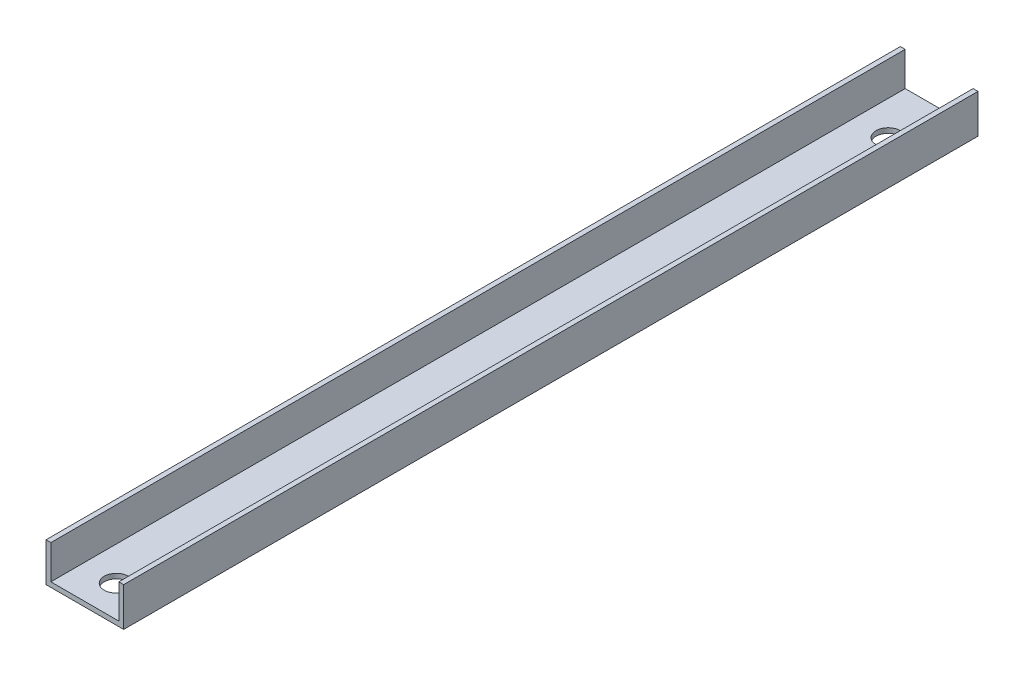
ISO-10303-21;
HEADER;
FILE_DESCRIPTION(('STEP AP214'),'2;1');
FILE_NAME('part.step','',(''),(''),'','','');
FILE_SCHEMA(('AUTOMOTIVE_DESIGN { 1 0 10303 214 1 1 1 1 }'));
ENDSEC;
DATA;
#1=APPLICATION_CONTEXT('core data for automotive mechanical design processes');
#2=APPLICATION_PROTOCOL_DEFINITION('international standard','automotive_design',2000,#1);
#3=PRODUCT_CONTEXT('',#1,'mechanical');
#4=PRODUCT('Part','Part','',(#3));
#5=PRODUCT_RELATED_PRODUCT_CATEGORY('part','',(#4));
#6=PRODUCT_DEFINITION_FORMATION('','',#4);
#7=PRODUCT_DEFINITION_CONTEXT('part definition',#1,'design');
#8=PRODUCT_DEFINITION('design','',#6,#7);
#9=PRODUCT_DEFINITION_SHAPE('','',#8);
#10=(LENGTH_UNIT() NAMED_UNIT(*) SI_UNIT(.MILLI.,.METRE.));
#11=(NAMED_UNIT(*) PLANE_ANGLE_UNIT() SI_UNIT($,.RADIAN.));
#12=(NAMED_UNIT(*) SI_UNIT($,.STERADIAN.) SOLID_ANGLE_UNIT());
#13=UNCERTAINTY_MEASURE_WITH_UNIT(LENGTH_MEASURE(1.E-05),#10,'distance_accuracy_value','');
#14=(GEOMETRIC_REPRESENTATION_CONTEXT(3) GLOBAL_UNCERTAINTY_ASSIGNED_CONTEXT((#13)) GLOBAL_UNIT_ASSIGNED_CONTEXT((#10,
#11,#12)) REPRESENTATION_CONTEXT('',''));
#15=CARTESIAN_POINT('',(0.,0.,0.));
#16=DIRECTION('',(0.,0.,1.));
#17=DIRECTION('',(1.,0.,0.));
#18=AXIS2_PLACEMENT_3D('',#15,#16,#17);
#19=CARTESIAN_POINT('',(-22.225,-9.525,558.8));
#20=DIRECTION('',(0.,-1.,0.));
#21=DIRECTION('',(0.,0.,-1.));
#22=AXIS2_PLACEMENT_3D('',#19,#20,#21);
#23=PLANE('',#22);
#24=CARTESIAN_POINT('',(0.,-9.525,538.1625));
#25=DIRECTION('',(0.,-1.,0.));
#26=DIRECTION('',(0.,0.,-1.));
#27=AXIS2_PLACEMENT_3D('',#24,#25,#26);
#28=CIRCLE('',#27,7.93750000000001);
#29=CARTESIAN_POINT('',(7.93750000000002,-9.525,538.1625));
#30=VERTEX_POINT('',#29);
#31=EDGE_CURVE('E185',#30,#30,#28,.F.);
#32=ORIENTED_EDGE('',*,*,#31,.F.);
#33=EDGE_LOOP('',(#32));
#34=FACE_BOUND('',#33,.T.);
#35=CARTESIAN_POINT('',(0.,-9.525,33.3375));
#36=DIRECTION('',(0.,-1.,0.));
#37=DIRECTION('',(0.,0.,-1.));
#38=AXIS2_PLACEMENT_3D('',#35,#36,#37);
#39=CIRCLE('',#38,7.9375);
#40=CARTESIAN_POINT('',(7.9375,-9.525,33.3375));
#41=VERTEX_POINT('',#40);
#42=EDGE_CURVE('E135',#41,#41,#39,.F.);
#43=ORIENTED_EDGE('',*,*,#42,.F.);
#44=EDGE_LOOP('',(#43));
#45=FACE_BOUND('',#44,.T.);
#46=DIRECTION('',(-1.,0.,0.));
#47=VECTOR('',#46,1.);
#48=CARTESIAN_POINT('',(-22.225,-9.525,0.));
#49=LINE('',#48,#47);
#50=CARTESIAN_POINT('',(22.225,-9.525,0.));
#51=VERTEX_POINT('',#50);
#52=CARTESIAN_POINT('',(-22.225,-9.525,0.));
#53=VERTEX_POINT('',#52);
#54=EDGE_CURVE('E131',#51,#53,#49,.T.);
#55=ORIENTED_EDGE('',*,*,#54,.T.);
#56=DIRECTION('',(0.,0.,-1.));
#57=VECTOR('',#56,1.);
#58=CARTESIAN_POINT('',(-22.225,-9.525,558.8));
#59=LINE('',#58,#57);
#60=CARTESIAN_POINT('',(-22.225,-9.525,558.8));
#61=VERTEX_POINT('',#60);
#62=EDGE_CURVE('E11',#61,#53,#59,.T.);
#63=ORIENTED_EDGE('',*,*,#62,.F.);
#64=DIRECTION('',(-1.,0.,0.));
#65=VECTOR('',#64,1.);
#66=CARTESIAN_POINT('',(-22.225,-9.525,558.8));
#67=LINE('',#66,#65);
#68=CARTESIAN_POINT('',(22.225,-9.525,558.8));
#69=VERTEX_POINT('',#68);
#70=EDGE_CURVE('E146',#69,#61,#67,.T.);
#71=ORIENTED_EDGE('',*,*,#70,.F.);
#72=DIRECTION('',(0.,0.,-1.));
#73=VECTOR('',#72,1.);
#74=CARTESIAN_POINT('',(22.225,-9.525,558.8));
#75=LINE('',#74,#73);
#76=EDGE_CURVE('E127',#69,#51,#75,.T.);
#77=ORIENTED_EDGE('',*,*,#76,.T.);
#78=EDGE_LOOP('',(#55,#63,#71,#77));
#79=FACE_BOUND('',#78,.T.);
#80=ADVANCED_FACE('F34',(#34,#45,#79),#23,.F.);
#81=CARTESIAN_POINT('',(-22.225,-9.525,558.8));
#82=DIRECTION('',(-1.,0.,0.));
#83=DIRECTION('',(0.,0.,1.));
#84=AXIS2_PLACEMENT_3D('',#81,#82,#83);
#85=PLANE('',#84);
#86=DIRECTION('',(0.,1.,0.));
#87=VECTOR('',#86,1.);
#88=CARTESIAN_POINT('',(-22.225,-9.525,0.));
#89=LINE('',#88,#87);
#90=CARTESIAN_POINT('',(-22.225,12.7,0.));
#91=VERTEX_POINT('',#90);
#92=EDGE_CURVE('E134',#53,#91,#89,.T.);
#93=ORIENTED_EDGE('',*,*,#92,.T.);
#94=DIRECTION('',(0.,0.,-1.));
#95=VECTOR('',#94,1.);
#96=CARTESIAN_POINT('',(-22.225,12.7,558.8));
#97=LINE('',#96,#95);
#98=CARTESIAN_POINT('',(-22.225,12.7,558.8));
#99=VERTEX_POINT('',#98);
#100=EDGE_CURVE('E43',#99,#91,#97,.T.);
#101=ORIENTED_EDGE('',*,*,#100,.F.);
#102=DIRECTION('',(0.,1.,0.));
#103=VECTOR('',#102,1.);
#104=CARTESIAN_POINT('',(-22.225,-9.525,558.8));
#105=LINE('',#104,#103);
#106=EDGE_CURVE('E94',#61,#99,#105,.T.);
#107=ORIENTED_EDGE('',*,*,#106,.F.);
#108=ORIENTED_EDGE('',*,*,#62,.T.);
#109=EDGE_LOOP('',(#93,#101,#107,#108));
#110=FACE_BOUND('',#109,.T.);
#111=ADVANCED_FACE('F208',(#110),#85,.F.);
#112=CARTESIAN_POINT('',(-25.4,12.7,558.8));
#113=DIRECTION('',(0.,-1.,0.));
#114=DIRECTION('',(0.,0.,-1.));
#115=AXIS2_PLACEMENT_3D('',#112,#113,#114);
#116=PLANE('',#115);
#117=DIRECTION('',(-1.,0.,0.));
#118=VECTOR('',#117,1.);
#119=CARTESIAN_POINT('',(-25.4,12.7,0.));
#120=LINE('',#119,#118);
#121=CARTESIAN_POINT('',(-25.4,12.7,0.));
#122=VERTEX_POINT('',#121);
#123=EDGE_CURVE('E137',#91,#122,#120,.T.);
#124=ORIENTED_EDGE('',*,*,#123,.T.);
#125=DIRECTION('',(0.,0.,-1.));
#126=VECTOR('',#125,1.);
#127=CARTESIAN_POINT('',(-25.4,12.7,558.8));
#128=LINE('',#127,#126);
#129=CARTESIAN_POINT('',(-25.4,12.7,558.8));
#130=VERTEX_POINT('',#129);
#131=EDGE_CURVE('E154',#130,#122,#128,.T.);
#132=ORIENTED_EDGE('',*,*,#131,.F.);
#133=DIRECTION('',(-1.,0.,0.));
#134=VECTOR('',#133,1.);
#135=CARTESIAN_POINT('',(-25.4,12.7,558.8));
#136=LINE('',#135,#134);
#137=EDGE_CURVE('E162',#99,#130,#136,.T.);
#138=ORIENTED_EDGE('',*,*,#137,.F.);
#139=ORIENTED_EDGE('',*,*,#100,.T.);
#140=EDGE_LOOP('',(#124,#132,#138,#139));
#141=FACE_BOUND('',#140,.T.);
#142=ADVANCED_FACE('F160',(#141),#116,.F.);
#143=CARTESIAN_POINT('',(-25.4,-12.7,558.8));
#144=DIRECTION('',(1.,0.,0.));
#145=DIRECTION('',(0.,1.,0.));
#146=AXIS2_PLACEMENT_3D('',#143,#144,#145);
#147=PLANE('',#146);
#148=DIRECTION('',(0.,-1.,0.));
#149=VECTOR('',#148,1.);
#150=CARTESIAN_POINT('',(-25.4,-12.7,0.));
#151=LINE('',#150,#149);
#152=CARTESIAN_POINT('',(-25.4,-12.7,0.));
#153=VERTEX_POINT('',#152);
#154=EDGE_CURVE('E139',#122,#153,#151,.T.);
#155=ORIENTED_EDGE('',*,*,#154,.T.);
#156=DIRECTION('',(0.,0.,-1.));
#157=VECTOR('',#156,1.);
#158=CARTESIAN_POINT('',(-25.4,-12.7,558.8));
#159=LINE('',#158,#157);
#160=CARTESIAN_POINT('',(-25.4,-12.7,558.8));
#161=VERTEX_POINT('',#160);
#162=EDGE_CURVE('E150',#161,#153,#159,.T.);
#163=ORIENTED_EDGE('',*,*,#162,.F.);
#164=DIRECTION('',(0.,-1.,0.));
#165=VECTOR('',#164,1.);
#166=CARTESIAN_POINT('',(-25.4,-12.7,558.8));
#167=LINE('',#166,#165);
#168=EDGE_CURVE('E174',#130,#161,#167,.T.);
#169=ORIENTED_EDGE('',*,*,#168,.F.);
#170=ORIENTED_EDGE('',*,*,#131,.T.);
#171=EDGE_LOOP('',(#155,#163,#169,#170));
#172=FACE_BOUND('',#171,.T.);
#173=ADVANCED_FACE('F170',(#172),#147,.F.);
#174=CARTESIAN_POINT('',(-25.4,-12.7,558.8));
#175=DIRECTION('',(0.,1.,0.));
#176=DIRECTION('',(-1.,0.,0.));
#177=AXIS2_PLACEMENT_3D('',#174,#175,#176);
#178=PLANE('',#177);
#179=CARTESIAN_POINT('',(0.,-12.7,538.1625));
#180=DIRECTION('',(0.,-1.,0.));
#181=DIRECTION('',(1.,0.,0.));
#182=AXIS2_PLACEMENT_3D('',#179,#180,#181);
#183=CIRCLE('',#182,7.93750000000001);
#184=CARTESIAN_POINT('',(7.93750000000002,-12.7,538.1625));
#185=VERTEX_POINT('',#184);
#186=EDGE_CURVE('E188',#185,#185,#183,.T.);
#187=ORIENTED_EDGE('',*,*,#186,.F.);
#188=EDGE_LOOP('',(#187));
#189=FACE_BOUND('',#188,.T.);
#190=CARTESIAN_POINT('',(0.,-12.7,33.3375));
#191=DIRECTION('',(0.,-1.,0.));
#192=DIRECTION('',(1.,0.,0.));
#193=AXIS2_PLACEMENT_3D('',#190,#191,#192);
#194=CIRCLE('',#193,7.9375);
#195=CARTESIAN_POINT('',(7.9375,-12.7,33.3375));
#196=VERTEX_POINT('',#195);
#197=EDGE_CURVE('E182',#196,#196,#194,.T.);
#198=ORIENTED_EDGE('',*,*,#197,.F.);
#199=EDGE_LOOP('',(#198));
#200=FACE_BOUND('',#199,.T.);
#201=DIRECTION('',(1.,0.,0.));
#202=VECTOR('',#201,1.);
#203=CARTESIAN_POINT('',(-25.4,-12.7,0.));
#204=LINE('',#203,#202);
#205=CARTESIAN_POINT('',(25.4,-12.7,0.));
#206=VERTEX_POINT('',#205);
#207=EDGE_CURVE('E141',#153,#206,#204,.T.);
#208=ORIENTED_EDGE('',*,*,#207,.T.);
#209=DIRECTION('',(0.,0.,-1.));
#210=VECTOR('',#209,1.);
#211=CARTESIAN_POINT('',(25.4,-12.7,558.8));
#212=LINE('',#211,#210);
#213=CARTESIAN_POINT('',(25.4,-12.7,558.8));
#214=VERTEX_POINT('',#213);
#215=EDGE_CURVE('E122',#214,#206,#212,.T.);
#216=ORIENTED_EDGE('',*,*,#215,.F.);
#217=DIRECTION('',(1.,0.,0.));
#218=VECTOR('',#217,1.);
#219=CARTESIAN_POINT('',(-25.4,-12.7,558.8));
#220=LINE('',#219,#218);
#221=EDGE_CURVE('E113',#161,#214,#220,.T.);
#222=ORIENTED_EDGE('',*,*,#221,.F.);
#223=ORIENTED_EDGE('',*,*,#162,.T.);
#224=EDGE_LOOP('',(#208,#216,#222,#223));
#225=FACE_BOUND('',#224,.T.);
#226=ADVANCED_FACE('F173',(#189,#200,#225),#178,.F.);
#227=CARTESIAN_POINT('',(25.4,-12.7,558.8));
#228=DIRECTION('',(-1.,0.,0.));
#229=DIRECTION('',(0.,-1.,0.));
#230=AXIS2_PLACEMENT_3D('',#227,#228,#229);
#231=PLANE('',#230);
#232=DIRECTION('',(0.,1.,0.));
#233=VECTOR('',#232,1.);
#234=CARTESIAN_POINT('',(25.4,-12.7,0.));
#235=LINE('',#234,#233);
#236=CARTESIAN_POINT('',(25.4,12.7,0.));
#237=VERTEX_POINT('',#236);
#238=EDGE_CURVE('E121',#206,#237,#235,.T.);
#239=ORIENTED_EDGE('',*,*,#238,.T.);
#240=DIRECTION('',(0.,0.,-1.));
#241=VECTOR('',#240,1.);
#242=CARTESIAN_POINT('',(25.4,12.7,558.8));
#243=LINE('',#242,#241);
#244=CARTESIAN_POINT('',(25.4,12.7,558.8));
#245=VERTEX_POINT('',#244);
#246=EDGE_CURVE('E118',#245,#237,#243,.T.);
#247=ORIENTED_EDGE('',*,*,#246,.F.);
#248=DIRECTION('',(0.,1.,0.));
#249=VECTOR('',#248,1.);
#250=CARTESIAN_POINT('',(25.4,-12.7,558.8));
#251=LINE('',#250,#249);
#252=EDGE_CURVE('E107',#214,#245,#251,.T.);
#253=ORIENTED_EDGE('',*,*,#252,.F.);
#254=ORIENTED_EDGE('',*,*,#215,.T.);
#255=EDGE_LOOP('',(#239,#247,#253,#254));
#256=FACE_BOUND('',#255,.T.);
#257=ADVANCED_FACE('F119',(#256),#231,.F.);
#258=CARTESIAN_POINT('',(22.225,12.7,558.8));
#259=DIRECTION('',(0.,-1.,0.));
#260=DIRECTION('',(0.,0.,-1.));
#261=AXIS2_PLACEMENT_3D('',#258,#259,#260);
#262=PLANE('',#261);
#263=DIRECTION('',(-1.,0.,0.));
#264=VECTOR('',#263,1.);
#265=CARTESIAN_POINT('',(22.225,12.7,0.));
#266=LINE('',#265,#264);
#267=CARTESIAN_POINT('',(22.225,12.7,0.));
#268=VERTEX_POINT('',#267);
#269=EDGE_CURVE('E80',#237,#268,#266,.T.);
#270=ORIENTED_EDGE('',*,*,#269,.T.);
#271=DIRECTION('',(0.,0.,-1.));
#272=VECTOR('',#271,1.);
#273=CARTESIAN_POINT('',(22.225,12.7,558.8));
#274=LINE('',#273,#272);
#275=CARTESIAN_POINT('',(22.225,12.7,558.8));
#276=VERTEX_POINT('',#275);
#277=EDGE_CURVE('E123',#276,#268,#274,.T.);
#278=ORIENTED_EDGE('',*,*,#277,.F.);
#279=DIRECTION('',(-1.,0.,0.));
#280=VECTOR('',#279,1.);
#281=CARTESIAN_POINT('',(22.225,12.7,558.8));
#282=LINE('',#281,#280);
#283=EDGE_CURVE('E111',#245,#276,#282,.T.);
#284=ORIENTED_EDGE('',*,*,#283,.F.);
#285=ORIENTED_EDGE('',*,*,#246,.T.);
#286=EDGE_LOOP('',(#270,#278,#284,#285));
#287=FACE_BOUND('',#286,.T.);
#288=ADVANCED_FACE('F125',(#287),#262,.F.);
#289=CARTESIAN_POINT('',(22.225,-9.525,558.8));
#290=DIRECTION('',(1.,0.,0.));
#291=DIRECTION('',(0.,0.,-1.));
#292=AXIS2_PLACEMENT_3D('',#289,#290,#291);
#293=PLANE('',#292);
#294=DIRECTION('',(0.,-1.,0.));
#295=VECTOR('',#294,1.);
#296=CARTESIAN_POINT('',(22.225,-9.525,0.));
#297=LINE('',#296,#295);
#298=EDGE_CURVE('E86',#268,#51,#297,.T.);
#299=ORIENTED_EDGE('',*,*,#298,.T.);
#300=ORIENTED_EDGE('',*,*,#76,.F.);
#301=DIRECTION('',(0.,-1.,0.));
#302=VECTOR('',#301,1.);
#303=CARTESIAN_POINT('',(22.225,-9.525,558.8));
#304=LINE('',#303,#302);
#305=EDGE_CURVE('E51',#276,#69,#304,.T.);
#306=ORIENTED_EDGE('',*,*,#305,.F.);
#307=ORIENTED_EDGE('',*,*,#277,.T.);
#308=EDGE_LOOP('',(#299,#300,#306,#307));
#309=FACE_BOUND('',#308,.T.);
#310=ADVANCED_FACE('F212',(#309),#293,.F.);
#311=CARTESIAN_POINT('',(0.,0.,558.8));
#312=DIRECTION('',(0.,0.,1.));
#313=DIRECTION('',(1.,0.,0.));
#314=AXIS2_PLACEMENT_3D('',#311,#312,#313);
#315=PLANE('',#314);
#316=ORIENTED_EDGE('',*,*,#70,.T.);
#317=ORIENTED_EDGE('',*,*,#106,.T.);
#318=ORIENTED_EDGE('',*,*,#137,.T.);
#319=ORIENTED_EDGE('',*,*,#168,.T.);
#320=ORIENTED_EDGE('',*,*,#221,.T.);
#321=ORIENTED_EDGE('',*,*,#252,.T.);
#322=ORIENTED_EDGE('',*,*,#283,.T.);
#323=ORIENTED_EDGE('',*,*,#305,.T.);
#324=EDGE_LOOP('',(#316,#317,#318,#319,#320,#321,#322,#323));
#325=FACE_BOUND('',#324,.T.);
#326=ADVANCED_FACE('F109',(#325),#315,.T.);
#327=CARTESIAN_POINT('',(0.,0.,0.));
#328=DIRECTION('',(0.,0.,1.));
#329=DIRECTION('',(1.,0.,0.));
#330=AXIS2_PLACEMENT_3D('',#327,#328,#329);
#331=PLANE('',#330);
#332=ORIENTED_EDGE('',*,*,#54,.F.);
#333=ORIENTED_EDGE('',*,*,#298,.F.);
#334=ORIENTED_EDGE('',*,*,#269,.F.);
#335=ORIENTED_EDGE('',*,*,#238,.F.);
#336=ORIENTED_EDGE('',*,*,#207,.F.);
#337=ORIENTED_EDGE('',*,*,#154,.F.);
#338=ORIENTED_EDGE('',*,*,#123,.F.);
#339=ORIENTED_EDGE('',*,*,#92,.F.);
#340=EDGE_LOOP('',(#332,#333,#334,#335,#336,#337,#338,#339));
#341=FACE_BOUND('',#340,.T.);
#342=ADVANCED_FACE('F166',(#341),#331,.F.);
#343=CARTESIAN_POINT('',(0.,12.701,33.3375));
#344=DIRECTION('',(0.,-1.,0.));
#345=DIRECTION('',(1.,0.,0.));
#346=AXIS2_PLACEMENT_3D('',#343,#344,#345);
#347=CYLINDRICAL_SURFACE('',#346,7.9375);
#348=CARTESIAN_POINT('',(7.9375,-12.7,33.3375));
#349=CARTESIAN_POINT('',(7.9375,-12.6669270833333,33.3375));
#350=CARTESIAN_POINT('',(7.9375,-12.6338541666667,33.3375));
#351=CARTESIAN_POINT('',(7.9375,-12.5677083333333,33.3375));
#352=CARTESIAN_POINT('',(7.9375,-12.5346354166667,33.3375));
#353=CARTESIAN_POINT('',(7.9375,-12.4684895833333,33.3375));
#354=CARTESIAN_POINT('',(7.9375,-12.4354166666667,33.3375));
#355=CARTESIAN_POINT('',(7.9375,-12.3692708333333,33.3375));
#356=CARTESIAN_POINT('',(7.9375,-12.3361979166667,33.3375));
#357=CARTESIAN_POINT('',(7.9375,-12.2700520833333,33.3375));
#358=CARTESIAN_POINT('',(7.9375,-12.2369791666667,33.3375));
#359=CARTESIAN_POINT('',(7.9375,-12.1708333333333,33.3375));
#360=CARTESIAN_POINT('',(7.9375,-12.1377604166667,33.3375));
#361=CARTESIAN_POINT('',(7.9375,-12.0716145833333,33.3375));
#362=CARTESIAN_POINT('',(7.9375,-12.0385416666667,33.3375));
#363=CARTESIAN_POINT('',(7.9375,-11.9723958333333,33.3375));
#364=CARTESIAN_POINT('',(7.9375,-11.9393229166667,33.3375));
#365=CARTESIAN_POINT('',(7.9375,-11.8731770833333,33.3375));
#366=CARTESIAN_POINT('',(7.9375,-11.8401041666667,33.3375));
#367=CARTESIAN_POINT('',(7.9375,-11.7739583333333,33.3375));
#368=CARTESIAN_POINT('',(7.9375,-11.7408854166667,33.3375));
#369=CARTESIAN_POINT('',(7.9375,-11.6747395833333,33.3375));
#370=CARTESIAN_POINT('',(7.9375,-11.6416666666667,33.3375));
#371=CARTESIAN_POINT('',(7.9375,-11.5755208333333,33.3375));
#372=CARTESIAN_POINT('',(7.9375,-11.5424479166667,33.3375));
#373=CARTESIAN_POINT('',(7.9375,-11.4763020833333,33.3375));
#374=CARTESIAN_POINT('',(7.9375,-11.4432291666667,33.3375));
#375=CARTESIAN_POINT('',(7.9375,-11.3770833333333,33.3375));
#376=CARTESIAN_POINT('',(7.9375,-11.3440104166667,33.3375));
#377=CARTESIAN_POINT('',(7.9375,-11.2778645833333,33.3375));
#378=CARTESIAN_POINT('',(7.9375,-11.2447916666667,33.3375));
#379=CARTESIAN_POINT('',(7.9375,-11.1786458333333,33.3375));
#380=CARTESIAN_POINT('',(7.9375,-11.1455729166667,33.3375));
#381=CARTESIAN_POINT('',(7.9375,-11.0794270833333,33.3375));
#382=CARTESIAN_POINT('',(7.9375,-11.0463541666667,33.3375));
#383=CARTESIAN_POINT('',(7.9375,-10.9802083333333,33.3375));
#384=CARTESIAN_POINT('',(7.9375,-10.9471354166667,33.3375));
#385=CARTESIAN_POINT('',(7.9375,-10.8809895833333,33.3375));
#386=CARTESIAN_POINT('',(7.9375,-10.8479166666667,33.3375));
#387=CARTESIAN_POINT('',(7.9375,-10.7817708333333,33.3375));
#388=CARTESIAN_POINT('',(7.9375,-10.7486979166667,33.3375));
#389=CARTESIAN_POINT('',(7.9375,-10.6825520833333,33.3375));
#390=CARTESIAN_POINT('',(7.9375,-10.6494791666667,33.3375));
#391=CARTESIAN_POINT('',(7.9375,-10.5833333333333,33.3375));
#392=CARTESIAN_POINT('',(7.9375,-10.5502604166667,33.3375));
#393=CARTESIAN_POINT('',(7.9375,-10.4841145833333,33.3375));
#394=CARTESIAN_POINT('',(7.9375,-10.4510416666667,33.3375));
#395=CARTESIAN_POINT('',(7.9375,-10.3848958333333,33.3375));
#396=CARTESIAN_POINT('',(7.9375,-10.3518229166667,33.3375));
#397=CARTESIAN_POINT('',(7.9375,-10.2856770833333,33.3375));
#398=CARTESIAN_POINT('',(7.9375,-10.2526041666667,33.3375));
#399=CARTESIAN_POINT('',(7.9375,-10.1864583333333,33.3375));
#400=CARTESIAN_POINT('',(7.9375,-10.1533854166667,33.3375));
#401=CARTESIAN_POINT('',(7.9375,-10.0872395833333,33.3375));
#402=CARTESIAN_POINT('',(7.9375,-10.0541666666667,33.3375));
#403=CARTESIAN_POINT('',(7.9375,-9.98802083333333,33.3375));
#404=CARTESIAN_POINT('',(7.9375,-9.95494791666666,33.3375));
#405=CARTESIAN_POINT('',(7.9375,-9.88880208333333,33.3375));
#406=CARTESIAN_POINT('',(7.9375,-9.85572916666666,33.3375));
#407=CARTESIAN_POINT('',(7.9375,-9.78958333333333,33.3375));
#408=CARTESIAN_POINT('',(7.9375,-9.75651041666666,33.3375));
#409=CARTESIAN_POINT('',(7.9375,-9.69036458333333,33.3375));
#410=CARTESIAN_POINT('',(7.9375,-9.65729166666666,33.3375));
#411=CARTESIAN_POINT('',(7.9375,-9.59114583333333,33.3375));
#412=CARTESIAN_POINT('',(7.9375,-9.55807291666666,33.3375));
#413=CARTESIAN_POINT('',(7.9375,-9.525,33.3375));
#414=B_SPLINE_CURVE_WITH_KNOTS('',3,(#348,#349,#350,#351,#352,#353,#354,#355,#356,#357,#358,
#359,#360,#361,#362,#363,#364,#365,#366,#367,#368,#369,#370,#371,#372,#373,#374,#375,#376,#377,
#378,#379,#380,#381,#382,#383,#384,#385,#386,#387,#388,#389,#390,#391,#392,#393,#394,#395,#396,
#397,#398,#399,#400,#401,#402,#403,#404,#405,#406,#407,#408,#409,#410,#411,#412,#413),
.UNSPECIFIED.,.F.,.F.,(4,2,2,2,2,2,2,2,2,2,2,2,2,2,2,2,2,2,2,2,2,2,2,2,2,2,2,2,2,2,2,2,4),(0.,
0.0992187500000012,0.198437499999999,0.29765625,0.396874999999998,0.496093749999999,0.5953125,
0.694531249999998,0.793749999999999,0.892968750000001,0.992187499999998,1.09140625,1.190625,
1.28984375,1.3890625,1.48828125,1.5875,1.68671875,1.7859375,1.88515625,1.984375,2.08359375,
2.1828125,2.28203125,2.38125,2.48046875,2.5796875,2.67890625,2.778125,2.87734375,2.9765625,
3.07578125,3.175),.UNSPECIFIED.);
#415=EDGE_CURVE('BSEAM200',#196,#41,#414,.T.);
#416=ORIENTED_EDGE('',*,*,#197,.T.);
#417=ORIENTED_EDGE('',*,*,#42,.T.);
#418=ORIENTED_EDGE('',*,*,#415,.T.);
#419=ORIENTED_EDGE('',*,*,#415,.F.);
#420=EDGE_LOOP('',(#416,#418,#417,#419));
#421=FACE_BOUND('',#420,.T.);
#422=ADVANCED_FACE('F200',(#421),#347,.F.);
#423=CARTESIAN_POINT('',(0.,12.701,538.1625));
#424=DIRECTION('',(0.,-1.,0.));
#425=DIRECTION('',(1.,0.,0.));
#426=AXIS2_PLACEMENT_3D('',#423,#424,#425);
#427=CYLINDRICAL_SURFACE('',#426,7.93750000000001);
#428=CARTESIAN_POINT('',(7.93750000000002,-12.7,538.1625));
#429=CARTESIAN_POINT('',(7.93750000000002,-12.6669270833333,538.1625));
#430=CARTESIAN_POINT('',(7.93750000000002,-12.6338541666667,538.1625));
#431=CARTESIAN_POINT('',(7.93750000000002,-12.5677083333333,538.1625));
#432=CARTESIAN_POINT('',(7.93750000000002,-12.5346354166667,538.1625));
#433=CARTESIAN_POINT('',(7.93750000000002,-12.4684895833333,538.1625));
#434=CARTESIAN_POINT('',(7.93750000000002,-12.4354166666667,538.1625));
#435=CARTESIAN_POINT('',(7.93750000000002,-12.3692708333333,538.1625));
#436=CARTESIAN_POINT('',(7.93750000000002,-12.3361979166667,538.1625));
#437=CARTESIAN_POINT('',(7.93750000000002,-12.2700520833333,538.1625));
#438=CARTESIAN_POINT('',(7.93750000000002,-12.2369791666667,538.1625));
#439=CARTESIAN_POINT('',(7.93750000000002,-12.1708333333333,538.1625));
#440=CARTESIAN_POINT('',(7.93750000000002,-12.1377604166667,538.1625));
#441=CARTESIAN_POINT('',(7.93750000000002,-12.0716145833333,538.1625));
#442=CARTESIAN_POINT('',(7.93750000000002,-12.0385416666667,538.1625));
#443=CARTESIAN_POINT('',(7.93750000000002,-11.9723958333333,538.1625));
#444=CARTESIAN_POINT('',(7.93750000000002,-11.9393229166667,538.1625));
#445=CARTESIAN_POINT('',(7.93750000000002,-11.8731770833333,538.1625));
#446=CARTESIAN_POINT('',(7.93750000000002,-11.8401041666667,538.1625));
#447=CARTESIAN_POINT('',(7.93750000000002,-11.7739583333333,538.1625));
#448=CARTESIAN_POINT('',(7.93750000000002,-11.7408854166667,538.1625));
#449=CARTESIAN_POINT('',(7.93750000000002,-11.6747395833333,538.1625));
#450=CARTESIAN_POINT('',(7.93750000000002,-11.6416666666667,538.1625));
#451=CARTESIAN_POINT('',(7.93750000000002,-11.5755208333333,538.1625));
#452=CARTESIAN_POINT('',(7.93750000000002,-11.5424479166667,538.1625));
#453=CARTESIAN_POINT('',(7.93750000000002,-11.4763020833333,538.1625));
#454=CARTESIAN_POINT('',(7.93750000000002,-11.4432291666667,538.1625));
#455=CARTESIAN_POINT('',(7.93750000000002,-11.3770833333333,538.1625));
#456=CARTESIAN_POINT('',(7.93750000000002,-11.3440104166667,538.1625));
#457=CARTESIAN_POINT('',(7.93750000000002,-11.2778645833333,538.1625));
#458=CARTESIAN_POINT('',(7.93750000000002,-11.2447916666667,538.1625));
#459=CARTESIAN_POINT('',(7.93750000000002,-11.1786458333333,538.1625));
#460=CARTESIAN_POINT('',(7.93750000000002,-11.1455729166667,538.1625));
#461=CARTESIAN_POINT('',(7.93750000000002,-11.0794270833333,538.1625));
#462=CARTESIAN_POINT('',(7.93750000000002,-11.0463541666667,538.1625));
#463=CARTESIAN_POINT('',(7.93750000000002,-10.9802083333333,538.1625));
#464=CARTESIAN_POINT('',(7.93750000000002,-10.9471354166667,538.1625));
#465=CARTESIAN_POINT('',(7.93750000000002,-10.8809895833333,538.1625));
#466=CARTESIAN_POINT('',(7.93750000000002,-10.8479166666667,538.1625));
#467=CARTESIAN_POINT('',(7.93750000000002,-10.7817708333333,538.1625));
#468=CARTESIAN_POINT('',(7.93750000000002,-10.7486979166667,538.1625));
#469=CARTESIAN_POINT('',(7.93750000000002,-10.6825520833333,538.1625));
#470=CARTESIAN_POINT('',(7.93750000000002,-10.6494791666667,538.1625));
#471=CARTESIAN_POINT('',(7.93750000000002,-10.5833333333333,538.1625));
#472=CARTESIAN_POINT('',(7.93750000000002,-10.5502604166667,538.1625));
#473=CARTESIAN_POINT('',(7.93750000000002,-10.4841145833333,538.1625));
#474=CARTESIAN_POINT('',(7.93750000000002,-10.4510416666667,538.1625));
#475=CARTESIAN_POINT('',(7.93750000000002,-10.3848958333333,538.1625));
#476=CARTESIAN_POINT('',(7.93750000000002,-10.3518229166667,538.1625));
#477=CARTESIAN_POINT('',(7.93750000000002,-10.2856770833333,538.1625));
#478=CARTESIAN_POINT('',(7.93750000000002,-10.2526041666667,538.1625));
#479=CARTESIAN_POINT('',(7.93750000000002,-10.1864583333333,538.1625));
#480=CARTESIAN_POINT('',(7.93750000000002,-10.1533854166667,538.1625));
#481=CARTESIAN_POINT('',(7.93750000000002,-10.0872395833333,538.1625));
#482=CARTESIAN_POINT('',(7.93750000000002,-10.0541666666667,538.1625));
#483=CARTESIAN_POINT('',(7.93750000000002,-9.98802083333333,538.1625));
#484=CARTESIAN_POINT('',(7.93750000000002,-9.95494791666666,538.1625));
#485=CARTESIAN_POINT('',(7.93750000000002,-9.88880208333333,538.1625));
#486=CARTESIAN_POINT('',(7.93750000000002,-9.85572916666666,538.1625));
#487=CARTESIAN_POINT('',(7.93750000000002,-9.78958333333333,538.1625));
#488=CARTESIAN_POINT('',(7.93750000000002,-9.75651041666666,538.1625));
#489=CARTESIAN_POINT('',(7.93750000000002,-9.69036458333333,538.1625));
#490=CARTESIAN_POINT('',(7.93750000000002,-9.65729166666666,538.1625));
#491=CARTESIAN_POINT('',(7.93750000000002,-9.59114583333333,538.1625));
#492=CARTESIAN_POINT('',(7.93750000000002,-9.55807291666666,538.1625));
#493=CARTESIAN_POINT('',(7.93750000000002,-9.525,538.1625));
#494=B_SPLINE_CURVE_WITH_KNOTS('',3,(#428,#429,#430,#431,#432,#433,#434,#435,#436,#437,#438,
#439,#440,#441,#442,#443,#444,#445,#446,#447,#448,#449,#450,#451,#452,#453,#454,#455,#456,#457,
#458,#459,#460,#461,#462,#463,#464,#465,#466,#467,#468,#469,#470,#471,#472,#473,#474,#475,#476,
#477,#478,#479,#480,#481,#482,#483,#484,#485,#486,#487,#488,#489,#490,#491,#492,#493),
.UNSPECIFIED.,.F.,.F.,(4,2,2,2,2,2,2,2,2,2,2,2,2,2,2,2,2,2,2,2,2,2,2,2,2,2,2,2,2,2,2,2,4),(0.,
0.0992187500000012,0.198437499999999,0.29765625,0.396874999999998,0.496093749999999,0.5953125,
0.694531249999998,0.793749999999999,0.892968750000001,0.992187499999998,1.09140625,1.190625,
1.28984375,1.3890625,1.48828125,1.5875,1.68671875,1.7859375,1.88515625,1.984375,2.08359375,
2.1828125,2.28203125,2.38125,2.48046875,2.5796875,2.67890625,2.778125,2.87734375,2.9765625,
3.07578125,3.175),.UNSPECIFIED.);
#495=EDGE_CURVE('BSEAM192',#185,#30,#494,.T.);
#496=ORIENTED_EDGE('',*,*,#186,.T.);
#497=ORIENTED_EDGE('',*,*,#31,.T.);
#498=ORIENTED_EDGE('',*,*,#495,.T.);
#499=ORIENTED_EDGE('',*,*,#495,.F.);
#500=EDGE_LOOP('',(#496,#498,#497,#499));
#501=FACE_BOUND('',#500,.T.);
#502=ADVANCED_FACE('F192',(#501),#427,.F.);
#503=CLOSED_SHELL('',(#80,#111,#142,#173,#226,#257,#288,#310,#326,#342,#422,#502));
#504=MANIFOLD_SOLID_BREP('B2',#503);
#505=ADVANCED_BREP_SHAPE_REPRESENTATION('',(#18,#504),#14);
#506=SHAPE_DEFINITION_REPRESENTATION(#9,#505);
ENDSEC;
END-ISO-10303-21;
